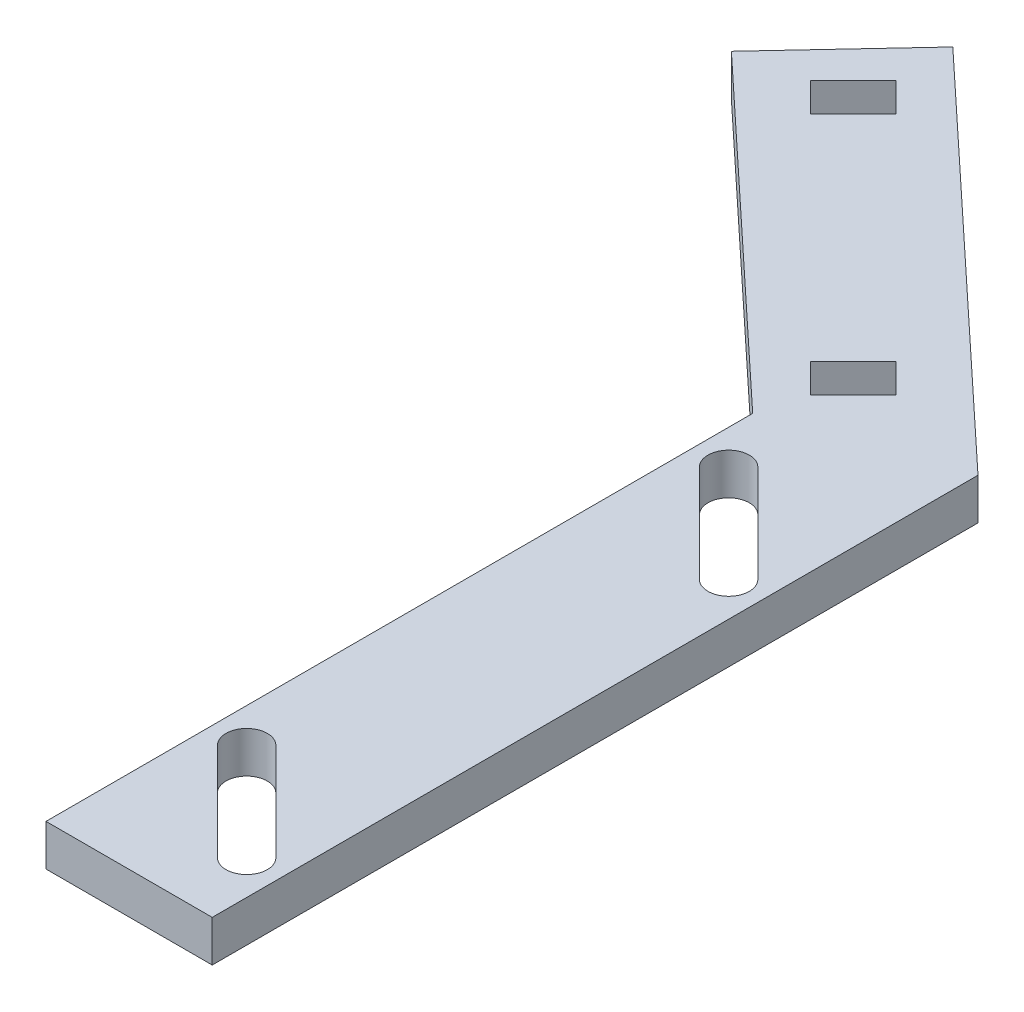
ISO-10303-21;
HEADER;
FILE_DESCRIPTION(('STEP AP214'),'2;1');
FILE_NAME('part.step','',(''),(''),'','','');
FILE_SCHEMA(('AUTOMOTIVE_DESIGN { 1 0 10303 214 1 1 1 1 }'));
ENDSEC;
DATA;
#1=APPLICATION_CONTEXT('core data for automotive mechanical design processes');
#2=APPLICATION_PROTOCOL_DEFINITION('international standard','automotive_design',2000,#1);
#3=PRODUCT_CONTEXT('',#1,'mechanical');
#4=PRODUCT('Part','Part','',(#3));
#5=PRODUCT_RELATED_PRODUCT_CATEGORY('part','',(#4));
#6=PRODUCT_DEFINITION_FORMATION('','',#4);
#7=PRODUCT_DEFINITION_CONTEXT('part definition',#1,'design');
#8=PRODUCT_DEFINITION('design','',#6,#7);
#9=PRODUCT_DEFINITION_SHAPE('','',#8);
#10=(LENGTH_UNIT() NAMED_UNIT(*) SI_UNIT(.MILLI.,.METRE.));
#11=(NAMED_UNIT(*) PLANE_ANGLE_UNIT() SI_UNIT($,.RADIAN.));
#12=(NAMED_UNIT(*) SI_UNIT($,.STERADIAN.) SOLID_ANGLE_UNIT());
#13=UNCERTAINTY_MEASURE_WITH_UNIT(LENGTH_MEASURE(1.E-05),#10,'distance_accuracy_value','');
#14=(GEOMETRIC_REPRESENTATION_CONTEXT(3) GLOBAL_UNCERTAINTY_ASSIGNED_CONTEXT((#13)) GLOBAL_UNIT_ASSIGNED_CONTEXT((#10,
#11,#12)) REPRESENTATION_CONTEXT('',''));
#15=CARTESIAN_POINT('',(0.,0.,0.));
#16=DIRECTION('',(0.,0.,1.));
#17=DIRECTION('',(1.,0.,0.));
#18=AXIS2_PLACEMENT_3D('',#15,#16,#17);
#19=CARTESIAN_POINT('',(24.6378371061868,3.,-24.6378371061869));
#20=DIRECTION('',(0.707106781186547,0.,-0.707106781186548));
#21=DIRECTION('',(-0.707106781186548,0.,-0.707106781186547));
#22=AXIS2_PLACEMENT_3D('',#19,#20,#21);
#23=PLANE('',#22);
#24=DIRECTION('',(0.707106781186548,0.,0.707106781186547));
#25=VECTOR('',#24,1.);
#26=CARTESIAN_POINT('',(24.6378371061868,0.,-24.6378371061869));
#27=LINE('',#26,#25);
#28=CARTESIAN_POINT('',(-3.25555600732711,0.,-52.5312302197008));
#29=VERTEX_POINT('',#28);
#30=CARTESIAN_POINT('',(-1.13423566376746,0.,-50.4099098761411));
#31=VERTEX_POINT('',#30);
#32=EDGE_CURVE('E271',#29,#31,#27,.T.);
#33=ORIENTED_EDGE('',*,*,#32,.T.);
#34=DIRECTION('',(0.,-1.,0.));
#35=VECTOR('',#34,1.);
#36=CARTESIAN_POINT('',(-1.13423566376746,3.,-50.4099098761411));
#37=LINE('',#36,#35);
#38=CARTESIAN_POINT('',(-1.13423566376746,3.,-50.4099098761411));
#39=VERTEX_POINT('',#38);
#40=EDGE_CURVE('E11',#39,#31,#37,.T.);
#41=ORIENTED_EDGE('',*,*,#40,.F.);
#42=DIRECTION('',(0.707106781186548,0.,0.707106781186547));
#43=VECTOR('',#42,1.);
#44=CARTESIAN_POINT('',(24.6378371061868,3.,-24.6378371061869));
#45=LINE('',#44,#43);
#46=CARTESIAN_POINT('',(-3.25555600732711,3.,-52.5312302197008));
#47=VERTEX_POINT('',#46);
#48=EDGE_CURVE('E200',#47,#39,#45,.T.);
#49=ORIENTED_EDGE('',*,*,#48,.F.);
#50=DIRECTION('',(0.,-1.,0.));
#51=VECTOR('',#50,1.);
#52=CARTESIAN_POINT('',(-3.25555600732711,3.,-52.5312302197008));
#53=LINE('',#52,#51);
#54=EDGE_CURVE('E56',#47,#29,#53,.T.);
#55=ORIENTED_EDGE('',*,*,#54,.T.);
#56=EDGE_LOOP('',(#33,#41,#49,#55));
#57=FACE_BOUND('',#56,.T.);
#58=ADVANCED_FACE('F37',(#57),#23,.F.);
#59=CARTESIAN_POINT('',(-25.7720727699543,3.,-25.7720727699543));
#60=DIRECTION('',(0.707106781186547,0.,0.707106781186547));
#61=DIRECTION('',(0.707106781186548,0.,-0.707106781186548));
#62=AXIS2_PLACEMENT_3D('',#59,#60,#61);
#63=PLANE('',#62);
#64=DIRECTION('',(-0.707106781186548,0.,0.707106781186548));
#65=VECTOR('',#64,1.);
#66=CARTESIAN_POINT('',(-25.7720727699543,0.,-25.7720727699543));
#67=LINE('',#66,#65);
#68=CARTESIAN_POINT('',(-4.24550550098843,0.,-47.2986400389202));
#69=VERTEX_POINT('',#68);
#70=EDGE_CURVE('E206',#31,#69,#67,.T.);
#71=ORIENTED_EDGE('',*,*,#70,.T.);
#72=DIRECTION('',(0.,-1.,0.));
#73=VECTOR('',#72,1.);
#74=CARTESIAN_POINT('',(-4.24550550098843,3.,-47.2986400389202));
#75=LINE('',#74,#73);
#76=CARTESIAN_POINT('',(-4.24550550098843,3.,-47.2986400389202));
#77=VERTEX_POINT('',#76);
#78=EDGE_CURVE('E47',#77,#69,#75,.T.);
#79=ORIENTED_EDGE('',*,*,#78,.F.);
#80=DIRECTION('',(-0.707106781186548,0.,0.707106781186548));
#81=VECTOR('',#80,1.);
#82=CARTESIAN_POINT('',(-25.7720727699543,3.,-25.7720727699543));
#83=LINE('',#82,#81);
#84=EDGE_CURVE('E194',#39,#77,#83,.T.);
#85=ORIENTED_EDGE('',*,*,#84,.F.);
#86=ORIENTED_EDGE('',*,*,#40,.T.);
#87=EDGE_LOOP('',(#71,#79,#85,#86));
#88=FACE_BOUND('',#87,.T.);
#89=ADVANCED_FACE('F205',(#88),#63,.F.);
#90=CARTESIAN_POINT('',(21.5265672689659,3.,-21.5265672689659));
#91=DIRECTION('',(0.707106781186548,0.,-0.707106781186547));
#92=DIRECTION('',(-0.707106781186547,0.,-0.707106781186548));
#93=AXIS2_PLACEMENT_3D('',#90,#91,#92);
#94=PLANE('',#93);
#95=DIRECTION('',(0.707106781186547,0.,0.707106781186548));
#96=VECTOR('',#95,1.);
#97=CARTESIAN_POINT('',(21.5265672689659,0.,-21.5265672689659));
#98=LINE('',#97,#96);
#99=CARTESIAN_POINT('',(-6.36682584454807,0.,-49.4199603824798));
#100=VERTEX_POINT('',#99);
#101=EDGE_CURVE('E274',#100,#69,#98,.T.);
#102=ORIENTED_EDGE('',*,*,#101,.F.);
#103=DIRECTION('',(0.,-1.,0.));
#104=VECTOR('',#103,1.);
#105=CARTESIAN_POINT('',(-6.36682584454807,3.,-49.4199603824798));
#106=LINE('',#105,#104);
#107=CARTESIAN_POINT('',(-6.36682584454807,3.,-49.4199603824798));
#108=VERTEX_POINT('',#107);
#109=EDGE_CURVE('E124',#108,#100,#106,.T.);
#110=ORIENTED_EDGE('',*,*,#109,.F.);
#111=DIRECTION('',(0.707106781186547,0.,0.707106781186548));
#112=VECTOR('',#111,1.);
#113=CARTESIAN_POINT('',(21.5265672689659,3.,-21.5265672689659));
#114=LINE('',#113,#112);
#115=EDGE_CURVE('E199',#108,#77,#114,.T.);
#116=ORIENTED_EDGE('',*,*,#115,.T.);
#117=ORIENTED_EDGE('',*,*,#78,.T.);
#118=EDGE_LOOP('',(#102,#110,#116,#117));
#119=FACE_BOUND('',#118,.T.);
#120=ADVANCED_FACE('F210',(#119),#94,.T.);
#121=CARTESIAN_POINT('',(24.6378371061868,3.,-24.6378371061866));
#122=DIRECTION('',(0.70710678118655,0.,-0.707106781186545));
#123=DIRECTION('',(-0.707106781186545,0.,-0.70710678118655));
#124=AXIS2_PLACEMENT_3D('',#121,#122,#123);
#125=PLANE('',#124);
#126=DIRECTION('',(0.707106781186545,0.,0.70710678118655));
#127=VECTOR('',#126,1.);
#128=CARTESIAN_POINT('',(24.6378371061868,0.,-24.6378371061866));
#129=LINE('',#128,#127);
#130=CARTESIAN_POINT('',(-20.933225536991,0.,-70.2088997493647));
#131=VERTEX_POINT('',#130);
#132=CARTESIAN_POINT('',(-18.8119051934314,0.,-68.087579405805));
#133=VERTEX_POINT('',#132);
#134=EDGE_CURVE('E259',#131,#133,#129,.T.);
#135=ORIENTED_EDGE('',*,*,#134,.T.);
#136=DIRECTION('',(0.,-1.,0.));
#137=VECTOR('',#136,1.);
#138=CARTESIAN_POINT('',(-18.8119051934314,3.,-68.087579405805));
#139=LINE('',#138,#137);
#140=CARTESIAN_POINT('',(-18.8119051934314,3.,-68.087579405805));
#141=VERTEX_POINT('',#140);
#142=EDGE_CURVE('E281',#141,#133,#139,.T.);
#143=ORIENTED_EDGE('',*,*,#142,.F.);
#144=DIRECTION('',(0.707106781186545,0.,0.70710678118655));
#145=VECTOR('',#144,1.);
#146=CARTESIAN_POINT('',(24.6378371061868,3.,-24.6378371061866));
#147=LINE('',#146,#145);
#148=CARTESIAN_POINT('',(-20.933225536991,3.,-70.2088997493647));
#149=VERTEX_POINT('',#148);
#150=EDGE_CURVE('E370',#149,#141,#147,.T.);
#151=ORIENTED_EDGE('',*,*,#150,.F.);
#152=DIRECTION('',(0.,-1.,0.));
#153=VECTOR('',#152,1.);
#154=CARTESIAN_POINT('',(-20.933225536991,3.,-70.2088997493647));
#155=LINE('',#154,#153);
#156=EDGE_CURVE('E283',#149,#131,#155,.T.);
#157=ORIENTED_EDGE('',*,*,#156,.T.);
#158=EDGE_LOOP('',(#135,#143,#151,#157));
#159=FACE_BOUND('',#158,.T.);
#160=ADVANCED_FACE('F396',(#159),#125,.F.);
#161=CARTESIAN_POINT('',(-43.4497422996182,3.,-43.4497422996183));
#162=DIRECTION('',(0.707106781186546,0.,0.707106781186548));
#163=DIRECTION('',(0.707106781186549,0.,-0.707106781186546));
#164=AXIS2_PLACEMENT_3D('',#161,#162,#163);
#165=PLANE('',#164);
#166=DIRECTION('',(-0.707106781186549,0.,0.707106781186546));
#167=VECTOR('',#166,1.);
#168=CARTESIAN_POINT('',(-43.4497422996182,0.,-43.4497422996183));
#169=LINE('',#168,#167);
#170=CARTESIAN_POINT('',(-21.9231750306523,0.,-64.9763095685842));
#171=VERTEX_POINT('',#170);
#172=EDGE_CURVE('E262',#133,#171,#169,.T.);
#173=ORIENTED_EDGE('',*,*,#172,.T.);
#174=DIRECTION('',(0.,-1.,0.));
#175=VECTOR('',#174,1.);
#176=CARTESIAN_POINT('',(-21.9231750306523,3.,-64.9763095685842));
#177=LINE('',#176,#175);
#178=CARTESIAN_POINT('',(-21.9231750306523,3.,-64.9763095685842));
#179=VERTEX_POINT('',#178);
#180=EDGE_CURVE('E288',#179,#171,#177,.T.);
#181=ORIENTED_EDGE('',*,*,#180,.F.);
#182=DIRECTION('',(-0.707106781186549,0.,0.707106781186546));
#183=VECTOR('',#182,1.);
#184=CARTESIAN_POINT('',(-43.4497422996182,3.,-43.4497422996183));
#185=LINE('',#184,#183);
#186=EDGE_CURVE('E373',#141,#179,#185,.T.);
#187=ORIENTED_EDGE('',*,*,#186,.F.);
#188=ORIENTED_EDGE('',*,*,#142,.T.);
#189=EDGE_LOOP('',(#173,#181,#187,#188));
#190=FACE_BOUND('',#189,.T.);
#191=ADVANCED_FACE('F398',(#190),#165,.F.);
#192=CARTESIAN_POINT('',(21.526567268966,3.,-21.5265672689661));
#193=DIRECTION('',(0.707106781186546,0.,-0.707106781186549));
#194=DIRECTION('',(-0.707106781186549,0.,-0.707106781186546));
#195=AXIS2_PLACEMENT_3D('',#192,#193,#194);
#196=PLANE('',#195);
#197=DIRECTION('',(0.707106781186549,0.,0.707106781186546));
#198=VECTOR('',#197,1.);
#199=CARTESIAN_POINT('',(21.526567268966,0.,-21.5265672689661));
#200=LINE('',#199,#198);
#201=CARTESIAN_POINT('',(-24.0444953742119,0.,-67.0976299121438));
#202=VERTEX_POINT('',#201);
#203=EDGE_CURVE('E265',#202,#171,#200,.T.);
#204=ORIENTED_EDGE('',*,*,#203,.F.);
#205=DIRECTION('',(0.,-1.,0.));
#206=VECTOR('',#205,1.);
#207=CARTESIAN_POINT('',(-24.0444953742119,3.,-67.0976299121438));
#208=LINE('',#207,#206);
#209=CARTESIAN_POINT('',(-24.0444953742119,3.,-67.0976299121438));
#210=VERTEX_POINT('',#209);
#211=EDGE_CURVE('E285',#210,#202,#208,.T.);
#212=ORIENTED_EDGE('',*,*,#211,.F.);
#213=DIRECTION('',(0.707106781186549,0.,0.707106781186546));
#214=VECTOR('',#213,1.);
#215=CARTESIAN_POINT('',(21.526567268966,3.,-21.5265672689661));
#216=LINE('',#215,#214);
#217=EDGE_CURVE('E375',#210,#179,#216,.T.);
#218=ORIENTED_EDGE('',*,*,#217,.T.);
#219=ORIENTED_EDGE('',*,*,#180,.T.);
#220=EDGE_LOOP('',(#204,#212,#218,#219));
#221=FACE_BOUND('',#220,.T.);
#222=ADVANCED_FACE('F391',(#221),#196,.T.);
#223=CARTESIAN_POINT('',(0.,3.,7.26040764008584));
#224=DIRECTION('',(0.,0.,-1.));
#225=DIRECTION('',(-1.,0.,0.));
#226=AXIS2_PLACEMENT_3D('',#223,#224,#225);
#227=PLANE('',#226);
#228=DIRECTION('',(1.,0.,0.));
#229=VECTOR('',#228,1.);
#230=CARTESIAN_POINT('',(0.,0.,7.26040764008584));
#231=LINE('',#230,#229);
#232=CARTESIAN_POINT('',(-5.18933982822037,0.,7.26040764008584));
#233=VERTEX_POINT('',#232);
#234=CARTESIAN_POINT('',(6.88172798364547,0.,7.26040764008584));
#235=VERTEX_POINT('',#234);
#236=EDGE_CURVE('E241',#233,#235,#231,.T.);
#237=ORIENTED_EDGE('',*,*,#236,.T.);
#238=DIRECTION('',(0.,-1.,0.));
#239=VECTOR('',#238,1.);
#240=CARTESIAN_POINT('',(6.88172798364547,3.,7.26040764008584));
#241=LINE('',#240,#239);
#242=CARTESIAN_POINT('',(6.88172798364547,3.,7.26040764008584));
#243=VERTEX_POINT('',#242);
#244=EDGE_CURVE('E286',#243,#235,#241,.T.);
#245=ORIENTED_EDGE('',*,*,#244,.F.);
#246=DIRECTION('',(1.,0.,0.));
#247=VECTOR('',#246,1.);
#248=CARTESIAN_POINT('',(0.,3.,7.26040764008584));
#249=LINE('',#248,#247);
#250=CARTESIAN_POINT('',(-5.18933982822037,3.,7.26040764008584));
#251=VERTEX_POINT('',#250);
#252=EDGE_CURVE('E354',#251,#243,#249,.T.);
#253=ORIENTED_EDGE('',*,*,#252,.F.);
#254=DIRECTION('',(0.,-1.,0.));
#255=VECTOR('',#254,1.);
#256=CARTESIAN_POINT('',(-5.18933982822037,3.,7.26040764008584));
#257=LINE('',#256,#255);
#258=EDGE_CURVE('E292',#251,#233,#257,.T.);
#259=ORIENTED_EDGE('',*,*,#258,.T.);
#260=EDGE_LOOP('',(#237,#245,#253,#259));
#261=FACE_BOUND('',#260,.T.);
#262=ADVANCED_FACE('F405',(#261),#227,.F.);
#263=CARTESIAN_POINT('',(6.88172798364547,3.,0.));
#264=DIRECTION('',(-1.,0.,0.));
#265=DIRECTION('',(0.,0.,1.));
#266=AXIS2_PLACEMENT_3D('',#263,#264,#265);
#267=PLANE('',#266);
#268=DIRECTION('',(0.,0.,-1.));
#269=VECTOR('',#268,1.);
#270=CARTESIAN_POINT('',(6.88172798364547,0.,0.));
#271=LINE('',#270,#269);
#272=CARTESIAN_POINT('',(6.88172798364547,0.,-48.346499533452));
#273=VERTEX_POINT('',#272);
#274=EDGE_CURVE('E244',#235,#273,#271,.T.);
#275=ORIENTED_EDGE('',*,*,#274,.T.);
#276=DIRECTION('',(0.,-1.,0.));
#277=VECTOR('',#276,1.);
#278=CARTESIAN_POINT('',(6.88172798364547,3.,-48.346499533452));
#279=LINE('',#278,#277);
#280=CARTESIAN_POINT('',(6.88172798364547,3.,-48.346499533452));
#281=VERTEX_POINT('',#280);
#282=EDGE_CURVE('E301',#281,#273,#279,.T.);
#283=ORIENTED_EDGE('',*,*,#282,.F.);
#284=DIRECTION('',(0.,0.,-1.));
#285=VECTOR('',#284,1.);
#286=CARTESIAN_POINT('',(6.88172798364547,3.,0.));
#287=LINE('',#286,#285);
#288=EDGE_CURVE('E357',#243,#281,#287,.T.);
#289=ORIENTED_EDGE('',*,*,#288,.F.);
#290=ORIENTED_EDGE('',*,*,#244,.T.);
#291=EDGE_LOOP('',(#275,#283,#289,#290));
#292=FACE_BOUND('',#291,.T.);
#293=ADVANCED_FACE('F451',(#292),#267,.F.);
#294=CARTESIAN_POINT('',(27.3249795602683,3.,-29.2461752351196));
#295=DIRECTION('',(0.682699369243088,0.,-0.730699371311547));
#296=DIRECTION('',(-0.730699371311547,0.,-0.682699369243088));
#297=AXIS2_PLACEMENT_3D('',#294,#295,#296);
#298=PLANE('',#297);
#299=DIRECTION('',(0.730699371311547,0.,0.682699369243088));
#300=VECTOR('',#299,1.);
#301=CARTESIAN_POINT('',(27.3249795602683,0.,-29.2461752351196));
#302=LINE('',#301,#300);
#303=CARTESIAN_POINT('',(-20.9664849826523,0.,-74.3653496557858));
#304=VERTEX_POINT('',#303);
#305=EDGE_CURVE('E247',#304,#273,#302,.T.);
#306=ORIENTED_EDGE('',*,*,#305,.F.);
#307=DIRECTION('',(0.,-1.,0.));
#308=VECTOR('',#307,1.);
#309=CARTESIAN_POINT('',(-20.9664849826523,3.,-74.3653496557858));
#310=LINE('',#309,#308);
#311=CARTESIAN_POINT('',(-20.9664849826523,3.,-74.3653496557858));
#312=VERTEX_POINT('',#311);
#313=EDGE_CURVE('E299',#312,#304,#310,.T.);
#314=ORIENTED_EDGE('',*,*,#313,.F.);
#315=DIRECTION('',(0.730699371311547,0.,0.682699369243088));
#316=VECTOR('',#315,1.);
#317=CARTESIAN_POINT('',(27.3249795602683,3.,-29.2461752351196));
#318=LINE('',#317,#316);
#319=EDGE_CURVE('E359',#312,#281,#318,.T.);
#320=ORIENTED_EDGE('',*,*,#319,.T.);
#321=ORIENTED_EDGE('',*,*,#282,.T.);
#322=EDGE_LOOP('',(#306,#314,#320,#321));
#323=FACE_BOUND('',#322,.T.);
#324=ADVANCED_FACE('F455',(#323),#298,.T.);
#325=CARTESIAN_POINT('',(-48.2914645429206,3.,-45.1191744206662));
#326=DIRECTION('',(0.730699371311547,0.,0.682699369243087));
#327=DIRECTION('',(0.682699369243087,0.,-0.730699371311547));
#328=AXIS2_PLACEMENT_3D('',#325,#326,#327);
#329=PLANE('',#328);
#330=DIRECTION('',(-0.682699369243087,0.,0.730699371311547));
#331=VECTOR('',#330,1.);
#332=CARTESIAN_POINT('',(-48.2914645429206,0.,-45.1191744206662));
#333=LINE('',#332,#331);
#334=CARTESIAN_POINT('',(-28.7333063070251,0.,-66.0524498429436));
#335=VERTEX_POINT('',#334);
#336=EDGE_CURVE('E250',#304,#335,#333,.T.);
#337=ORIENTED_EDGE('',*,*,#336,.T.);
#338=DIRECTION('',(0.,-1.,0.));
#339=VECTOR('',#338,1.);
#340=CARTESIAN_POINT('',(-28.7333063070251,3.,-66.0524498429436));
#341=LINE('',#340,#339);
#342=CARTESIAN_POINT('',(-28.7333063070251,3.,-66.0524498429436));
#343=VERTEX_POINT('',#342);
#344=EDGE_CURVE('E297',#343,#335,#341,.T.);
#345=ORIENTED_EDGE('',*,*,#344,.F.);
#346=DIRECTION('',(-0.682699369243087,0.,0.730699371311547));
#347=VECTOR('',#346,1.);
#348=CARTESIAN_POINT('',(-48.2914645429206,3.,-45.1191744206662));
#349=LINE('',#348,#347);
#350=EDGE_CURVE('E362',#312,#343,#349,.T.);
#351=ORIENTED_EDGE('',*,*,#350,.F.);
#352=ORIENTED_EDGE('',*,*,#313,.T.);
#353=EDGE_LOOP('',(#337,#345,#351,#352));
#354=FACE_BOUND('',#353,.T.);
#355=ADVANCED_FACE('F459',(#354),#329,.F.);
#356=CARTESIAN_POINT('',(19.5581582358955,3.,-20.9332754222774));
#357=DIRECTION('',(-0.682699369243087,0.,0.730699371311547));
#358=DIRECTION('',(0.730699371311547,0.,0.682699369243087));
#359=AXIS2_PLACEMENT_3D('',#356,#357,#358);
#360=PLANE('',#359);
#361=DIRECTION('',(-0.730699371311547,0.,-0.682699369243087));
#362=VECTOR('',#361,1.);
#363=CARTESIAN_POINT('',(19.5581582358955,0.,-20.9332754222774));
#364=LINE('',#363,#362);
#365=CARTESIAN_POINT('',(-5.18933982821995,0.,-44.0550981335667));
#366=VERTEX_POINT('',#365);
#367=EDGE_CURVE('E253',#366,#335,#364,.T.);
#368=ORIENTED_EDGE('',*,*,#367,.F.);
#369=DIRECTION('',(0.,-1.,0.));
#370=VECTOR('',#369,1.);
#371=CARTESIAN_POINT('',(-5.18933982821995,3.,-44.0550981335667));
#372=LINE('',#371,#370);
#373=CARTESIAN_POINT('',(-5.18933982821995,3.,-44.0550981335667));
#374=VERTEX_POINT('',#373);
#375=EDGE_CURVE('E294',#374,#366,#372,.T.);
#376=ORIENTED_EDGE('',*,*,#375,.F.);
#377=DIRECTION('',(-0.730699371311547,0.,-0.682699369243087));
#378=VECTOR('',#377,1.);
#379=CARTESIAN_POINT('',(19.5581582358955,3.,-20.9332754222774));
#380=LINE('',#379,#378);
#381=EDGE_CURVE('E364',#374,#343,#380,.T.);
#382=ORIENTED_EDGE('',*,*,#381,.T.);
#383=ORIENTED_EDGE('',*,*,#344,.T.);
#384=EDGE_LOOP('',(#368,#376,#382,#383));
#385=FACE_BOUND('',#384,.T.);
#386=ADVANCED_FACE('F437',(#385),#360,.T.);
#387=CARTESIAN_POINT('',(4.3817279836451,3.,-32.7395923599142));
#388=DIRECTION('',(0.,-1.,0.));
#389=DIRECTION('',(0.,0.,-1.));
#390=AXIS2_PLACEMENT_3D('',#387,#388,#389);
#391=CYLINDRICAL_SURFACE('',#390,1.49999999999999);
#392=CARTESIAN_POINT('',(4.3817279836451,0.,-32.7395923599142));
#393=DIRECTION('',(0.,1.,0.));
#394=DIRECTION('',(0.,0.,1.));
#395=AXIS2_PLACEMENT_3D('',#392,#393,#394);
#396=CIRCLE('',#395,1.49999999999999);
#397=CARTESIAN_POINT('',(3.32106781186529,0.,-31.6789321881343));
#398=VERTEX_POINT('',#397);
#399=CARTESIAN_POINT('',(5.44238815542492,0.,-33.800252531694));
#400=VERTEX_POINT('',#399);
#401=EDGE_CURVE('E229',#398,#400,#396,.T.);
#402=ORIENTED_EDGE('',*,*,#401,.F.);
#403=DIRECTION('',(0.,-1.,0.));
#404=VECTOR('',#403,1.);
#405=CARTESIAN_POINT('',(3.32106781186529,3.,-31.6789321881343));
#406=LINE('',#405,#404);
#407=CARTESIAN_POINT('',(3.32106781186529,3.,-31.6789321881343));
#408=VERTEX_POINT('',#407);
#409=EDGE_CURVE('E295',#408,#398,#406,.T.);
#410=ORIENTED_EDGE('',*,*,#409,.F.);
#411=CARTESIAN_POINT('',(4.3817279836451,3.,-32.7395923599142));
#412=DIRECTION('',(0.,1.,0.));
#413=DIRECTION('',(0.,0.,1.));
#414=AXIS2_PLACEMENT_3D('',#411,#412,#413);
#415=CIRCLE('',#414,1.49999999999999);
#416=CARTESIAN_POINT('',(5.44238815542492,3.,-33.800252531694));
#417=VERTEX_POINT('',#416);
#418=EDGE_CURVE('E337',#408,#417,#415,.T.);
#419=ORIENTED_EDGE('',*,*,#418,.T.);
#420=DIRECTION('',(0.,-1.,0.));
#421=VECTOR('',#420,1.);
#422=CARTESIAN_POINT('',(5.44238815542492,3.,-33.800252531694));
#423=LINE('',#422,#421);
#424=EDGE_CURVE('E305',#417,#400,#423,.T.);
#425=ORIENTED_EDGE('',*,*,#424,.T.);
#426=EDGE_LOOP('',(#402,#410,#419,#425));
#427=FACE_BOUND('',#426,.T.);
#428=ADVANCED_FACE('F433',(#427),#391,.F.);
#429=CARTESIAN_POINT('',(17.4999999999998,3.,-17.4999999999998));
#430=DIRECTION('',(0.707106781186548,0.,-0.707106781186547));
#431=DIRECTION('',(-0.707106781186547,0.,-0.707106781186548));
#432=AXIS2_PLACEMENT_3D('',#429,#430,#431);
#433=PLANE('',#432);
#434=DIRECTION('',(0.707106781186547,0.,0.707106781186548));
#435=VECTOR('',#434,1.);
#436=CARTESIAN_POINT('',(17.4999999999998,0.,-17.4999999999998));
#437=LINE('',#436,#435);
#438=CARTESIAN_POINT('',(-3.75000000000018,0.,-38.7499999999998));
#439=VERTEX_POINT('',#438);
#440=EDGE_CURVE('E232',#439,#398,#437,.T.);
#441=ORIENTED_EDGE('',*,*,#440,.F.);
#442=DIRECTION('',(0.,-1.,0.));
#443=VECTOR('',#442,1.);
#444=CARTESIAN_POINT('',(-3.75000000000018,3.,-38.7499999999998));
#445=LINE('',#444,#443);
#446=CARTESIAN_POINT('',(-3.75000000000018,3.,-38.7499999999998));
#447=VERTEX_POINT('',#446);
#448=EDGE_CURVE('E309',#447,#439,#445,.T.);
#449=ORIENTED_EDGE('',*,*,#448,.F.);
#450=DIRECTION('',(0.707106781186547,0.,0.707106781186548));
#451=VECTOR('',#450,1.);
#452=CARTESIAN_POINT('',(17.4999999999998,3.,-17.4999999999998));
#453=LINE('',#452,#451);
#454=EDGE_CURVE('E346',#447,#408,#453,.T.);
#455=ORIENTED_EDGE('',*,*,#454,.T.);
#456=ORIENTED_EDGE('',*,*,#409,.T.);
#457=EDGE_LOOP('',(#441,#449,#455,#456));
#458=FACE_BOUND('',#457,.T.);
#459=ADVANCED_FACE('F436',(#458),#433,.T.);
#460=CARTESIAN_POINT('',(-2.68933982822037,3.,-39.8106601717796));
#461=DIRECTION('',(0.,-1.,0.));
#462=DIRECTION('',(0.,0.,-1.));
#463=AXIS2_PLACEMENT_3D('',#460,#461,#462);
#464=CYLINDRICAL_SURFACE('',#463,1.49999999999999);
#465=CARTESIAN_POINT('',(-2.68933982822037,0.,-39.8106601717796));
#466=DIRECTION('',(0.,1.,0.));
#467=DIRECTION('',(0.,0.,1.));
#468=AXIS2_PLACEMENT_3D('',#465,#466,#467);
#469=CIRCLE('',#468,1.49999999999999);
#470=CARTESIAN_POINT('',(-1.62867965644056,0.,-40.8713203435595));
#471=VERTEX_POINT('',#470);
#472=EDGE_CURVE('E235',#471,#439,#469,.T.);
#473=ORIENTED_EDGE('',*,*,#472,.F.);
#474=DIRECTION('',(0.,-1.,0.));
#475=VECTOR('',#474,1.);
#476=CARTESIAN_POINT('',(-1.62867965644056,3.,-40.8713203435595));
#477=LINE('',#476,#475);
#478=CARTESIAN_POINT('',(-1.62867965644056,3.,-40.8713203435595));
#479=VERTEX_POINT('',#478);
#480=EDGE_CURVE('E307',#479,#471,#477,.T.);
#481=ORIENTED_EDGE('',*,*,#480,.F.);
#482=CARTESIAN_POINT('',(-2.68933982822037,3.,-39.8106601717796));
#483=DIRECTION('',(0.,1.,0.));
#484=DIRECTION('',(0.,0.,1.));
#485=AXIS2_PLACEMENT_3D('',#482,#483,#484);
#486=CIRCLE('',#485,1.49999999999999);
#487=EDGE_CURVE('E349',#479,#447,#486,.T.);
#488=ORIENTED_EDGE('',*,*,#487,.T.);
#489=ORIENTED_EDGE('',*,*,#448,.T.);
#490=EDGE_LOOP('',(#473,#481,#488,#489));
#491=FACE_BOUND('',#490,.T.);
#492=ADVANCED_FACE('F441',(#491),#464,.F.);
#493=CARTESIAN_POINT('',(4.38172798364547,3.,2.26040764008584));
#494=DIRECTION('',(0.,-1.,0.));
#495=DIRECTION('',(0.,0.,-1.));
#496=AXIS2_PLACEMENT_3D('',#493,#494,#495);
#497=CYLINDRICAL_SURFACE('',#496,1.5);
#498=CARTESIAN_POINT('',(4.38172798364547,0.,2.26040764008584));
#499=DIRECTION('',(0.,1.,0.));
#500=DIRECTION('',(0.,0.,1.));
#501=AXIS2_PLACEMENT_3D('',#498,#499,#500);
#502=CIRCLE('',#501,1.5);
#503=CARTESIAN_POINT('',(3.32106781186565,0.,3.32106781186566));
#504=VERTEX_POINT('',#503);
#505=CARTESIAN_POINT('',(5.4423881554253,0.,1.19974746830601));
#506=VERTEX_POINT('',#505);
#507=EDGE_CURVE('E217',#504,#506,#502,.T.);
#508=ORIENTED_EDGE('',*,*,#507,.F.);
#509=DIRECTION('',(0.,-1.,0.));
#510=VECTOR('',#509,1.);
#511=CARTESIAN_POINT('',(3.32106781186565,3.,3.32106781186566));
#512=LINE('',#511,#510);
#513=CARTESIAN_POINT('',(3.32106781186565,3.,3.32106781186566));
#514=VERTEX_POINT('',#513);
#515=EDGE_CURVE('E41',#514,#504,#512,.T.);
#516=ORIENTED_EDGE('',*,*,#515,.F.);
#517=CARTESIAN_POINT('',(4.38172798364547,3.,2.26040764008584));
#518=DIRECTION('',(0.,1.,0.));
#519=DIRECTION('',(0.,0.,1.));
#520=AXIS2_PLACEMENT_3D('',#517,#518,#519);
#521=CIRCLE('',#520,1.5);
#522=CARTESIAN_POINT('',(5.4423881554253,3.,1.19974746830601));
#523=VERTEX_POINT('',#522);
#524=EDGE_CURVE('E279',#514,#523,#521,.T.);
#525=ORIENTED_EDGE('',*,*,#524,.T.);
#526=DIRECTION('',(0.,-1.,0.));
#527=VECTOR('',#526,1.);
#528=CARTESIAN_POINT('',(5.4423881554253,3.,1.19974746830601));
#529=LINE('',#528,#527);
#530=EDGE_CURVE('E213',#523,#506,#529,.T.);
#531=ORIENTED_EDGE('',*,*,#530,.T.);
#532=EDGE_LOOP('',(#508,#516,#525,#531));
#533=FACE_BOUND('',#532,.T.);
#534=ADVANCED_FACE('F39',(#533),#497,.F.);
#535=CARTESIAN_POINT('',(0.,3.,0.));
#536=DIRECTION('',(0.707106781186547,0.,-0.707106781186548));
#537=DIRECTION('',(-0.707106781186548,0.,-0.707106781186547));
#538=AXIS2_PLACEMENT_3D('',#535,#536,#537);
#539=PLANE('',#538);
#540=DIRECTION('',(0.707106781186548,0.,0.707106781186547));
#541=VECTOR('',#540,1.);
#542=CARTESIAN_POINT('',(0.,0.,0.));
#543=LINE('',#542,#541);
#544=CARTESIAN_POINT('',(-3.74999999999983,0.,-3.74999999999982));
#545=VERTEX_POINT('',#544);
#546=EDGE_CURVE('E220',#545,#504,#543,.T.);
#547=ORIENTED_EDGE('',*,*,#546,.F.);
#548=DIRECTION('',(0.,-1.,0.));
#549=VECTOR('',#548,1.);
#550=CARTESIAN_POINT('',(-3.74999999999983,3.,-3.74999999999982));
#551=LINE('',#550,#549);
#552=CARTESIAN_POINT('',(-3.74999999999983,3.,-3.74999999999982));
#553=VERTEX_POINT('',#552);
#554=EDGE_CURVE('E314',#553,#545,#551,.T.);
#555=ORIENTED_EDGE('',*,*,#554,.F.);
#556=DIRECTION('',(0.707106781186548,0.,0.707106781186547));
#557=VECTOR('',#556,1.);
#558=CARTESIAN_POINT('',(0.,3.,0.));
#559=LINE('',#558,#557);
#560=EDGE_CURVE('E323',#553,#514,#559,.T.);
#561=ORIENTED_EDGE('',*,*,#560,.T.);
#562=ORIENTED_EDGE('',*,*,#515,.T.);
#563=EDGE_LOOP('',(#547,#555,#561,#562));
#564=FACE_BOUND('',#563,.T.);
#565=ADVANCED_FACE('F321',(#564),#539,.T.);
#566=CARTESIAN_POINT('',(-2.68933982822,3.,-4.81066017177964));
#567=DIRECTION('',(0.,-1.,0.));
#568=DIRECTION('',(0.,0.,-1.));
#569=AXIS2_PLACEMENT_3D('',#566,#567,#568);
#570=CYLINDRICAL_SURFACE('',#569,1.5);
#571=CARTESIAN_POINT('',(-2.68933982822,0.,-4.81066017177964));
#572=DIRECTION('',(0.,1.,0.));
#573=DIRECTION('',(0.,0.,1.));
#574=AXIS2_PLACEMENT_3D('',#571,#572,#573);
#575=CIRCLE('',#574,1.5);
#576=CARTESIAN_POINT('',(-1.62867965644018,0.,-5.87132034355946));
#577=VERTEX_POINT('',#576);
#578=EDGE_CURVE('E223',#577,#545,#575,.T.);
#579=ORIENTED_EDGE('',*,*,#578,.F.);
#580=DIRECTION('',(0.,-1.,0.));
#581=VECTOR('',#580,1.);
#582=CARTESIAN_POINT('',(-1.62867965644018,3.,-5.87132034355946));
#583=LINE('',#582,#581);
#584=CARTESIAN_POINT('',(-1.62867965644018,3.,-5.87132034355946));
#585=VERTEX_POINT('',#584);
#586=EDGE_CURVE('E313',#585,#577,#583,.T.);
#587=ORIENTED_EDGE('',*,*,#586,.F.);
#588=CARTESIAN_POINT('',(-2.68933982822,3.,-4.81066017177964));
#589=DIRECTION('',(0.,1.,0.));
#590=DIRECTION('',(0.,0.,1.));
#591=AXIS2_PLACEMENT_3D('',#588,#589,#590);
#592=CIRCLE('',#591,1.5);
#593=EDGE_CURVE('E332',#585,#553,#592,.T.);
#594=ORIENTED_EDGE('',*,*,#593,.T.);
#595=ORIENTED_EDGE('',*,*,#554,.T.);
#596=EDGE_LOOP('',(#579,#587,#594,#595));
#597=FACE_BOUND('',#596,.T.);
#598=ADVANCED_FACE('F329',(#597),#570,.F.);
#599=CARTESIAN_POINT('',(-45.5710626431778,3.,-45.5710626431779));
#600=DIRECTION('',(0.707106781186547,0.,0.707106781186548));
#601=DIRECTION('',(0.707106781186548,0.,-0.707106781186547));
#602=AXIS2_PLACEMENT_3D('',#599,#600,#601);
#603=PLANE('',#602);
#604=DIRECTION('',(-0.707106781186548,0.,0.707106781186547));
#605=VECTOR('',#604,1.);
#606=CARTESIAN_POINT('',(-45.5710626431778,0.,-45.5710626431779));
#607=LINE('',#606,#605);
#608=EDGE_CURVE('E268',#131,#202,#607,.T.);
#609=ORIENTED_EDGE('',*,*,#608,.F.);
#610=ORIENTED_EDGE('',*,*,#156,.F.);
#611=DIRECTION('',(-0.707106781186548,0.,0.707106781186547));
#612=VECTOR('',#611,1.);
#613=CARTESIAN_POINT('',(-45.5710626431778,3.,-45.5710626431779));
#614=LINE('',#613,#612);
#615=EDGE_CURVE('E378',#149,#210,#614,.T.);
#616=ORIENTED_EDGE('',*,*,#615,.T.);
#617=ORIENTED_EDGE('',*,*,#211,.T.);
#618=EDGE_LOOP('',(#609,#610,#616,#617));
#619=FACE_BOUND('',#618,.T.);
#620=ADVANCED_FACE('F383',(#619),#603,.T.);
#621=CARTESIAN_POINT('',(-5.18933982822365,3.,-4.36001188979555E-13));
#622=DIRECTION('',(-1.,0.,0.));
#623=DIRECTION('',(0.,0.,1.));
#624=AXIS2_PLACEMENT_3D('',#621,#622,#623);
#625=PLANE('',#624);
#626=DIRECTION('',(0.,0.,-1.));
#627=VECTOR('',#626,1.);
#628=CARTESIAN_POINT('',(-5.18933982822365,0.,-4.36001188979555E-13));
#629=LINE('',#628,#627);
#630=EDGE_CURVE('E256',#233,#366,#629,.T.);
#631=ORIENTED_EDGE('',*,*,#630,.F.);
#632=ORIENTED_EDGE('',*,*,#258,.F.);
#633=DIRECTION('',(0.,0.,-1.));
#634=VECTOR('',#633,1.);
#635=CARTESIAN_POINT('',(-5.18933982822365,3.,-4.36001188979555E-13));
#636=LINE('',#635,#634);
#637=EDGE_CURVE('E367',#251,#374,#636,.T.);
#638=ORIENTED_EDGE('',*,*,#637,.T.);
#639=ORIENTED_EDGE('',*,*,#375,.T.);
#640=EDGE_LOOP('',(#631,#632,#638,#639));
#641=FACE_BOUND('',#640,.T.);
#642=ADVANCED_FACE('F417',(#641),#625,.T.);
#643=CARTESIAN_POINT('',(19.6213203435595,3.,-19.6213203435595));
#644=DIRECTION('',(0.707106781186547,0.,-0.707106781186548));
#645=DIRECTION('',(-0.707106781186548,0.,-0.707106781186547));
#646=AXIS2_PLACEMENT_3D('',#643,#644,#645);
#647=PLANE('',#646);
#648=DIRECTION('',(0.707106781186548,0.,0.707106781186547));
#649=VECTOR('',#648,1.);
#650=CARTESIAN_POINT('',(19.6213203435595,0.,-19.6213203435595));
#651=LINE('',#650,#649);
#652=EDGE_CURVE('E238',#471,#400,#651,.T.);
#653=ORIENTED_EDGE('',*,*,#652,.T.);
#654=ORIENTED_EDGE('',*,*,#424,.F.);
#655=DIRECTION('',(0.707106781186548,0.,0.707106781186547));
#656=VECTOR('',#655,1.);
#657=CARTESIAN_POINT('',(19.6213203435595,3.,-19.6213203435595));
#658=LINE('',#657,#656);
#659=EDGE_CURVE('E352',#479,#417,#658,.T.);
#660=ORIENTED_EDGE('',*,*,#659,.F.);
#661=ORIENTED_EDGE('',*,*,#480,.T.);
#662=EDGE_LOOP('',(#653,#654,#660,#661));
#663=FACE_BOUND('',#662,.T.);
#664=ADVANCED_FACE('F422',(#663),#647,.F.);
#665=CARTESIAN_POINT('',(2.12132034355964,3.,-2.12132034355964));
#666=DIRECTION('',(0.707106781186547,0.,-0.707106781186547));
#667=DIRECTION('',(-0.707106781186548,0.,-0.707106781186548));
#668=AXIS2_PLACEMENT_3D('',#665,#666,#667);
#669=PLANE('',#668);
#670=DIRECTION('',(0.707106781186548,0.,0.707106781186548));
#671=VECTOR('',#670,1.);
#672=CARTESIAN_POINT('',(2.12132034355964,0.,-2.12132034355964));
#673=LINE('',#672,#671);
#674=EDGE_CURVE('E226',#577,#506,#673,.T.);
#675=ORIENTED_EDGE('',*,*,#674,.T.);
#676=ORIENTED_EDGE('',*,*,#530,.F.);
#677=DIRECTION('',(0.707106781186548,0.,0.707106781186548));
#678=VECTOR('',#677,1.);
#679=CARTESIAN_POINT('',(2.12132034355964,3.,-2.12132034355964));
#680=LINE('',#679,#678);
#681=EDGE_CURVE('E334',#585,#523,#680,.T.);
#682=ORIENTED_EDGE('',*,*,#681,.F.);
#683=ORIENTED_EDGE('',*,*,#586,.T.);
#684=EDGE_LOOP('',(#675,#676,#682,#683));
#685=FACE_BOUND('',#684,.T.);
#686=ADVANCED_FACE('F335',(#685),#669,.F.);
#687=CARTESIAN_POINT('',(-27.893393113514,3.,-27.8933931135139));
#688=DIRECTION('',(0.707106781186548,0.,0.707106781186547));
#689=DIRECTION('',(0.707106781186547,0.,-0.707106781186548));
#690=AXIS2_PLACEMENT_3D('',#687,#688,#689);
#691=PLANE('',#690);
#692=DIRECTION('',(-0.707106781186547,0.,0.707106781186548));
#693=VECTOR('',#692,1.);
#694=CARTESIAN_POINT('',(-27.893393113514,0.,-27.8933931135139));
#695=LINE('',#694,#693);
#696=EDGE_CURVE('E276',#29,#100,#695,.T.);
#697=ORIENTED_EDGE('',*,*,#696,.F.);
#698=ORIENTED_EDGE('',*,*,#54,.F.);
#699=DIRECTION('',(-0.707106781186547,0.,0.707106781186548));
#700=VECTOR('',#699,1.);
#701=CARTESIAN_POINT('',(-27.893393113514,3.,-27.8933931135139));
#702=LINE('',#701,#700);
#703=EDGE_CURVE('E211',#47,#108,#702,.T.);
#704=ORIENTED_EDGE('',*,*,#703,.T.);
#705=ORIENTED_EDGE('',*,*,#109,.T.);
#706=EDGE_LOOP('',(#697,#698,#704,#705));
#707=FACE_BOUND('',#706,.T.);
#708=ADVANCED_FACE('F432',(#707),#691,.T.);
#709=CARTESIAN_POINT('',(0.,3.,0.));
#710=DIRECTION('',(0.,1.,0.));
#711=DIRECTION('',(0.,0.,1.));
#712=AXIS2_PLACEMENT_3D('',#709,#710,#711);
#713=PLANE('',#712);
#714=ORIENTED_EDGE('',*,*,#524,.F.);
#715=ORIENTED_EDGE('',*,*,#560,.F.);
#716=ORIENTED_EDGE('',*,*,#593,.F.);
#717=ORIENTED_EDGE('',*,*,#681,.T.);
#718=EDGE_LOOP('',(#714,#715,#716,#717));
#719=FACE_BOUND('',#718,.T.);
#720=ORIENTED_EDGE('',*,*,#418,.F.);
#721=ORIENTED_EDGE('',*,*,#454,.F.);
#722=ORIENTED_EDGE('',*,*,#487,.F.);
#723=ORIENTED_EDGE('',*,*,#659,.T.);
#724=EDGE_LOOP('',(#720,#721,#722,#723));
#725=FACE_BOUND('',#724,.T.);
#726=ORIENTED_EDGE('',*,*,#252,.T.);
#727=ORIENTED_EDGE('',*,*,#288,.T.);
#728=ORIENTED_EDGE('',*,*,#319,.F.);
#729=ORIENTED_EDGE('',*,*,#350,.T.);
#730=ORIENTED_EDGE('',*,*,#381,.F.);
#731=ORIENTED_EDGE('',*,*,#637,.F.);
#732=EDGE_LOOP('',(#726,#727,#728,#729,#730,#731));
#733=FACE_BOUND('',#732,.T.);
#734=ORIENTED_EDGE('',*,*,#150,.T.);
#735=ORIENTED_EDGE('',*,*,#186,.T.);
#736=ORIENTED_EDGE('',*,*,#217,.F.);
#737=ORIENTED_EDGE('',*,*,#615,.F.);
#738=EDGE_LOOP('',(#734,#735,#736,#737));
#739=FACE_BOUND('',#738,.T.);
#740=ORIENTED_EDGE('',*,*,#48,.T.);
#741=ORIENTED_EDGE('',*,*,#84,.T.);
#742=ORIENTED_EDGE('',*,*,#115,.F.);
#743=ORIENTED_EDGE('',*,*,#703,.F.);
#744=EDGE_LOOP('',(#740,#741,#742,#743));
#745=FACE_BOUND('',#744,.T.);
#746=ADVANCED_FACE('F196',(#719,#725,#733,#739,#745),#713,.T.);
#747=CARTESIAN_POINT('',(0.,0.,0.));
#748=DIRECTION('',(0.,1.,0.));
#749=DIRECTION('',(0.,0.,1.));
#750=AXIS2_PLACEMENT_3D('',#747,#748,#749);
#751=PLANE('',#750);
#752=ORIENTED_EDGE('',*,*,#507,.T.);
#753=ORIENTED_EDGE('',*,*,#674,.F.);
#754=ORIENTED_EDGE('',*,*,#578,.T.);
#755=ORIENTED_EDGE('',*,*,#546,.T.);
#756=EDGE_LOOP('',(#752,#753,#754,#755));
#757=FACE_BOUND('',#756,.T.);
#758=ORIENTED_EDGE('',*,*,#401,.T.);
#759=ORIENTED_EDGE('',*,*,#652,.F.);
#760=ORIENTED_EDGE('',*,*,#472,.T.);
#761=ORIENTED_EDGE('',*,*,#440,.T.);
#762=EDGE_LOOP('',(#758,#759,#760,#761));
#763=FACE_BOUND('',#762,.T.);
#764=ORIENTED_EDGE('',*,*,#236,.F.);
#765=ORIENTED_EDGE('',*,*,#630,.T.);
#766=ORIENTED_EDGE('',*,*,#367,.T.);
#767=ORIENTED_EDGE('',*,*,#336,.F.);
#768=ORIENTED_EDGE('',*,*,#305,.T.);
#769=ORIENTED_EDGE('',*,*,#274,.F.);
#770=EDGE_LOOP('',(#764,#765,#766,#767,#768,#769));
#771=FACE_BOUND('',#770,.T.);
#772=ORIENTED_EDGE('',*,*,#134,.F.);
#773=ORIENTED_EDGE('',*,*,#608,.T.);
#774=ORIENTED_EDGE('',*,*,#203,.T.);
#775=ORIENTED_EDGE('',*,*,#172,.F.);
#776=EDGE_LOOP('',(#772,#773,#774,#775));
#777=FACE_BOUND('',#776,.T.);
#778=ORIENTED_EDGE('',*,*,#32,.F.);
#779=ORIENTED_EDGE('',*,*,#696,.T.);
#780=ORIENTED_EDGE('',*,*,#101,.T.);
#781=ORIENTED_EDGE('',*,*,#70,.F.);
#782=EDGE_LOOP('',(#778,#779,#780,#781));
#783=FACE_BOUND('',#782,.T.);
#784=ADVANCED_FACE('F327',(#757,#763,#771,#777,#783),#751,.F.);
#785=CLOSED_SHELL('',(#58,#89,#120,#160,#191,#222,#262,#293,#324,#355,#386,#428,#459,#492,#534,
#565,#598,#620,#642,#664,#686,#708,#746,#784));
#786=MANIFOLD_SOLID_BREP('B2',#785);
#787=ADVANCED_BREP_SHAPE_REPRESENTATION('',(#18,#786),#14);
#788=SHAPE_DEFINITION_REPRESENTATION(#9,#787);
ENDSEC;
END-ISO-10303-21;
